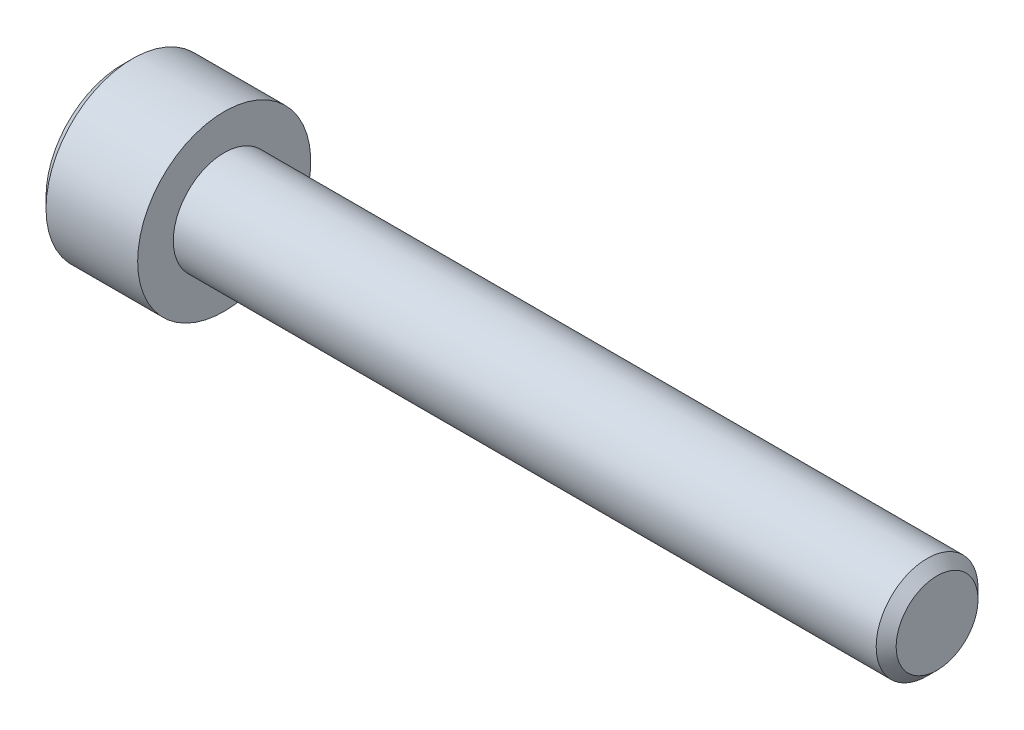
ISO-10303-21;
HEADER;
FILE_DESCRIPTION(('STEP AP214'),'2;1');
FILE_NAME('part.step','',(''),(''),'','','');
FILE_SCHEMA(('AUTOMOTIVE_DESIGN { 1 0 10303 214 1 1 1 1 }'));
ENDSEC;
DATA;
#1=APPLICATION_CONTEXT('core data for automotive mechanical design processes');
#2=APPLICATION_PROTOCOL_DEFINITION('international standard','automotive_design',2000,#1);
#3=PRODUCT_CONTEXT('',#1,'mechanical');
#4=PRODUCT('Part','Part','',(#3));
#5=PRODUCT_RELATED_PRODUCT_CATEGORY('part','',(#4));
#6=PRODUCT_DEFINITION_FORMATION('','',#4);
#7=PRODUCT_DEFINITION_CONTEXT('part definition',#1,'design');
#8=PRODUCT_DEFINITION('design','',#6,#7);
#9=PRODUCT_DEFINITION_SHAPE('','',#8);
#10=(LENGTH_UNIT() NAMED_UNIT(*) SI_UNIT(.MILLI.,.METRE.));
#11=(NAMED_UNIT(*) PLANE_ANGLE_UNIT() SI_UNIT($,.RADIAN.));
#12=(NAMED_UNIT(*) SI_UNIT($,.STERADIAN.) SOLID_ANGLE_UNIT());
#13=UNCERTAINTY_MEASURE_WITH_UNIT(LENGTH_MEASURE(1.E-05),#10,'distance_accuracy_value','');
#14=(GEOMETRIC_REPRESENTATION_CONTEXT(3) GLOBAL_UNCERTAINTY_ASSIGNED_CONTEXT((#13)) GLOBAL_UNIT_ASSIGNED_CONTEXT((#10,
#11,#12)) REPRESENTATION_CONTEXT('',''));
#15=CARTESIAN_POINT('',(0.,0.,0.));
#16=DIRECTION('',(0.,0.,1.));
#17=DIRECTION('',(1.,0.,0.));
#18=AXIS2_PLACEMENT_3D('',#15,#16,#17);
#19=CARTESIAN_POINT('',(-5.,-3.75,0.));
#20=DIRECTION('',(-1.,0.,0.));
#21=DIRECTION('',(0.,0.,1.));
#22=AXIS2_PLACEMENT_3D('',#19,#20,#21);
#23=PLANE('',#22);
#24=DIRECTION('',(0.,0.5,-0.866025403784439));
#25=VECTOR('',#24,1.);
#26=CARTESIAN_POINT('',(-5.,1.15470053837925,2.));
#27=LINE('',#26,#25);
#28=CARTESIAN_POINT('',(-5.,1.15470053837925,2.));
#29=VERTEX_POINT('',#28);
#30=CARTESIAN_POINT('',(-5.,2.3094010767585,0.));
#31=VERTEX_POINT('',#30);
#32=EDGE_CURVE('E59',#29,#31,#27,.T.);
#33=ORIENTED_EDGE('',*,*,#32,.F.);
#34=DIRECTION('',(0.,1.,0.));
#35=VECTOR('',#34,1.);
#36=CARTESIAN_POINT('',(-5.,-1.15470053837925,2.));
#37=LINE('',#36,#35);
#38=CARTESIAN_POINT('',(-5.,-1.15470053837925,2.));
#39=VERTEX_POINT('',#38);
#40=EDGE_CURVE('E142',#39,#29,#37,.T.);
#41=ORIENTED_EDGE('',*,*,#40,.F.);
#42=DIRECTION('',(0.,0.5,0.866025403784439));
#43=VECTOR('',#42,1.);
#44=CARTESIAN_POINT('',(-5.,-2.3094010767585,0.));
#45=LINE('',#44,#43);
#46=CARTESIAN_POINT('',(-5.,-2.3094010767585,0.));
#47=VERTEX_POINT('',#46);
#48=EDGE_CURVE('E140',#47,#39,#45,.T.);
#49=ORIENTED_EDGE('',*,*,#48,.F.);
#50=DIRECTION('',(0.,-0.5,0.866025403784439));
#51=VECTOR('',#50,1.);
#52=CARTESIAN_POINT('',(-5.,-1.15470053837925,-2.));
#53=LINE('',#52,#51);
#54=CARTESIAN_POINT('',(-5.,-1.15470053837925,-2.));
#55=VERTEX_POINT('',#54);
#56=EDGE_CURVE('E107',#55,#47,#53,.T.);
#57=ORIENTED_EDGE('',*,*,#56,.F.);
#58=DIRECTION('',(0.,-1.,0.));
#59=VECTOR('',#58,1.);
#60=CARTESIAN_POINT('',(-5.,1.15470053837925,-2.));
#61=LINE('',#60,#59);
#62=CARTESIAN_POINT('',(-5.,1.15470053837925,-2.));
#63=VERTEX_POINT('',#62);
#64=EDGE_CURVE('E136',#63,#55,#61,.T.);
#65=ORIENTED_EDGE('',*,*,#64,.F.);
#66=DIRECTION('',(0.,-0.5,-0.866025403784439));
#67=VECTOR('',#66,1.);
#68=CARTESIAN_POINT('',(-5.,2.3094010767585,0.));
#69=LINE('',#68,#67);
#70=EDGE_CURVE('E133',#31,#63,#69,.T.);
#71=ORIENTED_EDGE('',*,*,#70,.F.);
#72=EDGE_LOOP('',(#33,#41,#49,#57,#65,#71));
#73=FACE_BOUND('',#72,.T.);
#74=CARTESIAN_POINT('',(-5.,0.,0.));
#75=DIRECTION('',(-1.,0.,0.));
#76=DIRECTION('',(0.,0.,1.));
#77=AXIS2_PLACEMENT_3D('',#74,#75,#76);
#78=CIRCLE('',#77,3.75);
#79=CARTESIAN_POINT('',(-5.,0.,3.75));
#80=VERTEX_POINT('',#79);
#81=EDGE_CURVE('E146',#80,#80,#78,.T.);
#82=ORIENTED_EDGE('',*,*,#81,.T.);
#83=EDGE_LOOP('',(#82));
#84=FACE_BOUND('',#83,.T.);
#85=ADVANCED_FACE('F45',(#73,#84),#23,.T.);
#86=CARTESIAN_POINT('',(35.,0.,0.));
#87=DIRECTION('',(1.,0.,0.));
#88=DIRECTION('',(0.,0.,-1.));
#89=AXIS2_PLACEMENT_3D('',#86,#87,#88);
#90=PLANE('',#89);
#91=CARTESIAN_POINT('',(35.,0.,0.));
#92=DIRECTION('',(-1.,0.,0.));
#93=DIRECTION('',(0.,0.,1.));
#94=AXIS2_PLACEMENT_3D('',#91,#92,#93);
#95=CIRCLE('',#94,2.0095);
#96=CARTESIAN_POINT('',(35.,0.,2.0095));
#97=VERTEX_POINT('',#96);
#98=EDGE_CURVE('E11',#97,#97,#95,.T.);
#99=ORIENTED_EDGE('',*,*,#98,.F.);
#100=EDGE_LOOP('',(#99));
#101=FACE_BOUND('',#100,.T.);
#102=ADVANCED_FACE('F170',(#101),#90,.T.);
#103=CARTESIAN_POINT('',(34.5095,0.,0.));
#104=DIRECTION('',(-1.,0.,0.));
#105=DIRECTION('',(0.,0.,1.));
#106=AXIS2_PLACEMENT_3D('',#103,#104,#105);
#107=CONICAL_SURFACE('',#106,2.5,0.785398163397443);
#108=ORIENTED_EDGE('',*,*,#98,.T.);
#109=EDGE_LOOP('',(#108));
#110=FACE_BOUND('',#109,.T.);
#111=CARTESIAN_POINT('',(34.5095,0.,0.));
#112=DIRECTION('',(-1.,0.,0.));
#113=DIRECTION('',(0.,0.,1.));
#114=AXIS2_PLACEMENT_3D('',#111,#112,#113);
#115=CIRCLE('',#114,2.5);
#116=CARTESIAN_POINT('',(34.5095,0.,2.5));
#117=VERTEX_POINT('',#116);
#118=EDGE_CURVE('E52',#117,#117,#115,.T.);
#119=ORIENTED_EDGE('',*,*,#118,.F.);
#120=EDGE_LOOP('',(#119));
#121=FACE_BOUND('',#120,.T.);
#122=ADVANCED_FACE('F168',(#110,#121),#107,.T.);
#123=CARTESIAN_POINT('',(-7.,0.,0.));
#124=DIRECTION('',(-1.,0.,0.));
#125=DIRECTION('',(0.,0.,1.));
#126=AXIS2_PLACEMENT_3D('',#123,#124,#125);
#127=CYLINDRICAL_SURFACE('',#126,2.5);
#128=ORIENTED_EDGE('',*,*,#118,.T.);
#129=EDGE_LOOP('',(#128));
#130=FACE_BOUND('',#129,.T.);
#131=CARTESIAN_POINT('',(0.,0.,0.));
#132=DIRECTION('',(-1.,0.,0.));
#133=DIRECTION('',(0.,0.,1.));
#134=AXIS2_PLACEMENT_3D('',#131,#132,#133);
#135=CIRCLE('',#134,2.5);
#136=CARTESIAN_POINT('',(0.,0.,2.5));
#137=VERTEX_POINT('',#136);
#138=EDGE_CURVE('E160',#137,#137,#135,.T.);
#139=ORIENTED_EDGE('',*,*,#138,.F.);
#140=EDGE_LOOP('',(#139));
#141=FACE_BOUND('',#140,.T.);
#142=ADVANCED_FACE('F165',(#130,#141),#127,.T.);
#143=CARTESIAN_POINT('',(0.,-2.5,0.));
#144=DIRECTION('',(1.,0.,0.));
#145=DIRECTION('',(0.,0.,-1.));
#146=AXIS2_PLACEMENT_3D('',#143,#144,#145);
#147=PLANE('',#146);
#148=ORIENTED_EDGE('',*,*,#138,.T.);
#149=EDGE_LOOP('',(#148));
#150=FACE_BOUND('',#149,.T.);
#151=CARTESIAN_POINT('',(0.,0.,0.));
#152=DIRECTION('',(-1.,0.,0.));
#153=DIRECTION('',(0.,0.,1.));
#154=AXIS2_PLACEMENT_3D('',#151,#152,#153);
#155=CIRCLE('',#154,4.25);
#156=CARTESIAN_POINT('',(0.,0.,4.25));
#157=VERTEX_POINT('',#156);
#158=EDGE_CURVE('E157',#157,#157,#155,.T.);
#159=ORIENTED_EDGE('',*,*,#158,.F.);
#160=EDGE_LOOP('',(#159));
#161=FACE_BOUND('',#160,.T.);
#162=ADVANCED_FACE('F178',(#150,#161),#147,.T.);
#163=CARTESIAN_POINT('',(-7.,0.,0.));
#164=DIRECTION('',(-1.,0.,0.));
#165=DIRECTION('',(0.,0.,1.));
#166=AXIS2_PLACEMENT_3D('',#163,#164,#165);
#167=CYLINDRICAL_SURFACE('',#166,4.25);
#168=ORIENTED_EDGE('',*,*,#158,.T.);
#169=EDGE_LOOP('',(#168));
#170=FACE_BOUND('',#169,.T.);
#171=CARTESIAN_POINT('',(-4.5,0.,0.));
#172=DIRECTION('',(-1.,0.,0.));
#173=DIRECTION('',(0.,0.,1.));
#174=AXIS2_PLACEMENT_3D('',#171,#172,#173);
#175=CIRCLE('',#174,4.25);
#176=CARTESIAN_POINT('',(-4.5,0.,4.25));
#177=VERTEX_POINT('',#176);
#178=EDGE_CURVE('E154',#177,#177,#175,.T.);
#179=ORIENTED_EDGE('',*,*,#178,.F.);
#180=EDGE_LOOP('',(#179));
#181=FACE_BOUND('',#180,.T.);
#182=ADVANCED_FACE('F194',(#170,#181),#167,.T.);
#183=CARTESIAN_POINT('',(-5.,0.,0.));
#184=DIRECTION('',(1.,0.,0.));
#185=DIRECTION('',(0.,0.,-1.));
#186=AXIS2_PLACEMENT_3D('',#183,#184,#185);
#187=CONICAL_SURFACE('',#186,3.75,0.785398163397445);
#188=ORIENTED_EDGE('',*,*,#178,.T.);
#189=EDGE_LOOP('',(#188));
#190=FACE_BOUND('',#189,.T.);
#191=ORIENTED_EDGE('',*,*,#81,.F.);
#192=EDGE_LOOP('',(#191));
#193=FACE_BOUND('',#192,.T.);
#194=ADVANCED_FACE('F192',(#190,#193),#187,.T.);
#195=CARTESIAN_POINT('',(-2.5,1.15470053837925,2.));
#196=DIRECTION('',(0.,0.866025403784439,0.5));
#197=DIRECTION('',(0.,-0.5,0.866025403784439));
#198=AXIS2_PLACEMENT_3D('',#195,#196,#197);
#199=PLANE('',#198);
#200=ORIENTED_EDGE('',*,*,#32,.T.);
#201=DIRECTION('',(-1.,0.,0.));
#202=VECTOR('',#201,1.);
#203=CARTESIAN_POINT('',(-2.5,2.3094010767585,0.));
#204=LINE('',#203,#202);
#205=CARTESIAN_POINT('',(-2.5,2.3094010767585,0.));
#206=VERTEX_POINT('',#205);
#207=EDGE_CURVE('E89',#206,#31,#204,.T.);
#208=ORIENTED_EDGE('',*,*,#207,.F.);
#209=DIRECTION('',(0.,0.5,-0.866025403784439));
#210=VECTOR('',#209,1.);
#211=CARTESIAN_POINT('',(-2.5,1.15470053837925,2.));
#212=LINE('',#211,#210);
#213=CARTESIAN_POINT('',(-2.5,1.15470053837925,2.));
#214=VERTEX_POINT('',#213);
#215=EDGE_CURVE('E144',#214,#206,#212,.T.);
#216=ORIENTED_EDGE('',*,*,#215,.F.);
#217=DIRECTION('',(-1.,0.,0.));
#218=VECTOR('',#217,1.);
#219=CARTESIAN_POINT('',(-2.5,1.15470053837925,2.));
#220=LINE('',#219,#218);
#221=EDGE_CURVE('E67',#214,#29,#220,.T.);
#222=ORIENTED_EDGE('',*,*,#221,.T.);
#223=EDGE_LOOP('',(#200,#208,#216,#222));
#224=FACE_BOUND('',#223,.T.);
#225=ADVANCED_FACE('F193',(#224),#199,.F.);
#226=CARTESIAN_POINT('',(-2.5,-1.15470053837925,2.));
#227=DIRECTION('',(0.,0.,1.));
#228=DIRECTION('',(1.,0.,0.));
#229=AXIS2_PLACEMENT_3D('',#226,#227,#228);
#230=PLANE('',#229);
#231=ORIENTED_EDGE('',*,*,#40,.T.);
#232=ORIENTED_EDGE('',*,*,#221,.F.);
#233=DIRECTION('',(0.,1.,0.));
#234=VECTOR('',#233,1.);
#235=CARTESIAN_POINT('',(-2.5,-1.15470053837925,2.));
#236=LINE('',#235,#234);
#237=CARTESIAN_POINT('',(-2.5,-1.15470053837925,2.));
#238=VERTEX_POINT('',#237);
#239=EDGE_CURVE('E119',#238,#214,#236,.T.);
#240=ORIENTED_EDGE('',*,*,#239,.F.);
#241=DIRECTION('',(-1.,0.,0.));
#242=VECTOR('',#241,1.);
#243=CARTESIAN_POINT('',(-2.5,-1.15470053837925,2.));
#244=LINE('',#243,#242);
#245=EDGE_CURVE('E111',#238,#39,#244,.T.);
#246=ORIENTED_EDGE('',*,*,#245,.T.);
#247=EDGE_LOOP('',(#231,#232,#240,#246));
#248=FACE_BOUND('',#247,.T.);
#249=ADVANCED_FACE('F200',(#248),#230,.F.);
#250=CARTESIAN_POINT('',(-2.5,-2.3094010767585,0.));
#251=DIRECTION('',(0.,-0.866025403784439,0.5));
#252=DIRECTION('',(0.,-0.5,-0.866025403784439));
#253=AXIS2_PLACEMENT_3D('',#250,#251,#252);
#254=PLANE('',#253);
#255=ORIENTED_EDGE('',*,*,#48,.T.);
#256=ORIENTED_EDGE('',*,*,#245,.F.);
#257=DIRECTION('',(0.,0.5,0.866025403784439));
#258=VECTOR('',#257,1.);
#259=CARTESIAN_POINT('',(-2.5,-2.3094010767585,0.));
#260=LINE('',#259,#258);
#261=CARTESIAN_POINT('',(-2.5,-2.3094010767585,0.));
#262=VERTEX_POINT('',#261);
#263=EDGE_CURVE('E115',#262,#238,#260,.T.);
#264=ORIENTED_EDGE('',*,*,#263,.F.);
#265=DIRECTION('',(-1.,0.,0.));
#266=VECTOR('',#265,1.);
#267=CARTESIAN_POINT('',(-2.5,-2.3094010767585,0.));
#268=LINE('',#267,#266);
#269=EDGE_CURVE('E100',#262,#47,#268,.T.);
#270=ORIENTED_EDGE('',*,*,#269,.T.);
#271=EDGE_LOOP('',(#255,#256,#264,#270));
#272=FACE_BOUND('',#271,.T.);
#273=ADVANCED_FACE('F116',(#272),#254,.F.);
#274=CARTESIAN_POINT('',(-2.5,-1.15470053837925,-2.));
#275=DIRECTION('',(0.,-0.866025403784439,-0.5));
#276=DIRECTION('',(0.,0.5,-0.866025403784439));
#277=AXIS2_PLACEMENT_3D('',#274,#275,#276);
#278=PLANE('',#277);
#279=ORIENTED_EDGE('',*,*,#56,.T.);
#280=ORIENTED_EDGE('',*,*,#269,.F.);
#281=DIRECTION('',(0.,-0.5,0.866025403784439));
#282=VECTOR('',#281,1.);
#283=CARTESIAN_POINT('',(-2.5,-1.15470053837925,-2.));
#284=LINE('',#283,#282);
#285=CARTESIAN_POINT('',(-2.5,-1.15470053837925,-2.));
#286=VERTEX_POINT('',#285);
#287=EDGE_CURVE('E104',#286,#262,#284,.T.);
#288=ORIENTED_EDGE('',*,*,#287,.F.);
#289=DIRECTION('',(-1.,0.,0.));
#290=VECTOR('',#289,1.);
#291=CARTESIAN_POINT('',(-2.5,-1.15470053837925,-2.));
#292=LINE('',#291,#290);
#293=EDGE_CURVE('E112',#286,#55,#292,.T.);
#294=ORIENTED_EDGE('',*,*,#293,.T.);
#295=EDGE_LOOP('',(#279,#280,#288,#294));
#296=FACE_BOUND('',#295,.T.);
#297=ADVANCED_FACE('F102',(#296),#278,.F.);
#298=CARTESIAN_POINT('',(-2.5,1.15470053837925,-2.));
#299=DIRECTION('',(0.,0.,-1.));
#300=DIRECTION('',(-1.,0.,0.));
#301=AXIS2_PLACEMENT_3D('',#298,#299,#300);
#302=PLANE('',#301);
#303=ORIENTED_EDGE('',*,*,#64,.T.);
#304=ORIENTED_EDGE('',*,*,#293,.F.);
#305=DIRECTION('',(0.,-1.,0.));
#306=VECTOR('',#305,1.);
#307=CARTESIAN_POINT('',(-2.5,1.15470053837925,-2.));
#308=LINE('',#307,#306);
#309=CARTESIAN_POINT('',(-2.5,1.15470053837925,-2.));
#310=VERTEX_POINT('',#309);
#311=EDGE_CURVE('E125',#310,#286,#308,.T.);
#312=ORIENTED_EDGE('',*,*,#311,.F.);
#313=DIRECTION('',(-1.,0.,0.));
#314=VECTOR('',#313,1.);
#315=CARTESIAN_POINT('',(-2.5,1.15470053837925,-2.));
#316=LINE('',#315,#314);
#317=EDGE_CURVE('E149',#310,#63,#316,.T.);
#318=ORIENTED_EDGE('',*,*,#317,.T.);
#319=EDGE_LOOP('',(#303,#304,#312,#318));
#320=FACE_BOUND('',#319,.T.);
#321=ADVANCED_FACE('F259',(#320),#302,.F.);
#322=CARTESIAN_POINT('',(-2.5,2.3094010767585,0.));
#323=DIRECTION('',(0.,0.866025403784439,-0.5));
#324=DIRECTION('',(0.,0.5,0.866025403784439));
#325=AXIS2_PLACEMENT_3D('',#322,#323,#324);
#326=PLANE('',#325);
#327=ORIENTED_EDGE('',*,*,#70,.T.);
#328=ORIENTED_EDGE('',*,*,#317,.F.);
#329=DIRECTION('',(0.,-0.5,-0.866025403784439));
#330=VECTOR('',#329,1.);
#331=CARTESIAN_POINT('',(-2.5,2.3094010767585,0.));
#332=LINE('',#331,#330);
#333=EDGE_CURVE('E127',#206,#310,#332,.T.);
#334=ORIENTED_EDGE('',*,*,#333,.F.);
#335=ORIENTED_EDGE('',*,*,#207,.T.);
#336=EDGE_LOOP('',(#327,#328,#334,#335));
#337=FACE_BOUND('',#336,.T.);
#338=ADVANCED_FACE('F268',(#337),#326,.F.);
#339=CARTESIAN_POINT('',(-2.5,0.,0.));
#340=DIRECTION('',(-1.,0.,0.));
#341=DIRECTION('',(0.,0.,1.));
#342=AXIS2_PLACEMENT_3D('',#339,#340,#341);
#343=PLANE('',#342);
#344=ORIENTED_EDGE('',*,*,#215,.T.);
#345=ORIENTED_EDGE('',*,*,#333,.T.);
#346=ORIENTED_EDGE('',*,*,#311,.T.);
#347=ORIENTED_EDGE('',*,*,#287,.T.);
#348=ORIENTED_EDGE('',*,*,#263,.T.);
#349=ORIENTED_EDGE('',*,*,#239,.T.);
#350=EDGE_LOOP('',(#344,#345,#346,#347,#348,#349));
#351=FACE_BOUND('',#350,.T.);
#352=ADVANCED_FACE('F122',(#351),#343,.T.);
#353=CLOSED_SHELL('',(#85,#102,#122,#142,#162,#182,#194,#225,#249,#273,#297,#321,#338,#352));
#354=MANIFOLD_SOLID_BREP('B2',#353);
#355=ADVANCED_BREP_SHAPE_REPRESENTATION('',(#18,#354),#14);
#356=SHAPE_DEFINITION_REPRESENTATION(#9,#355);
ENDSEC;
END-ISO-10303-21;
